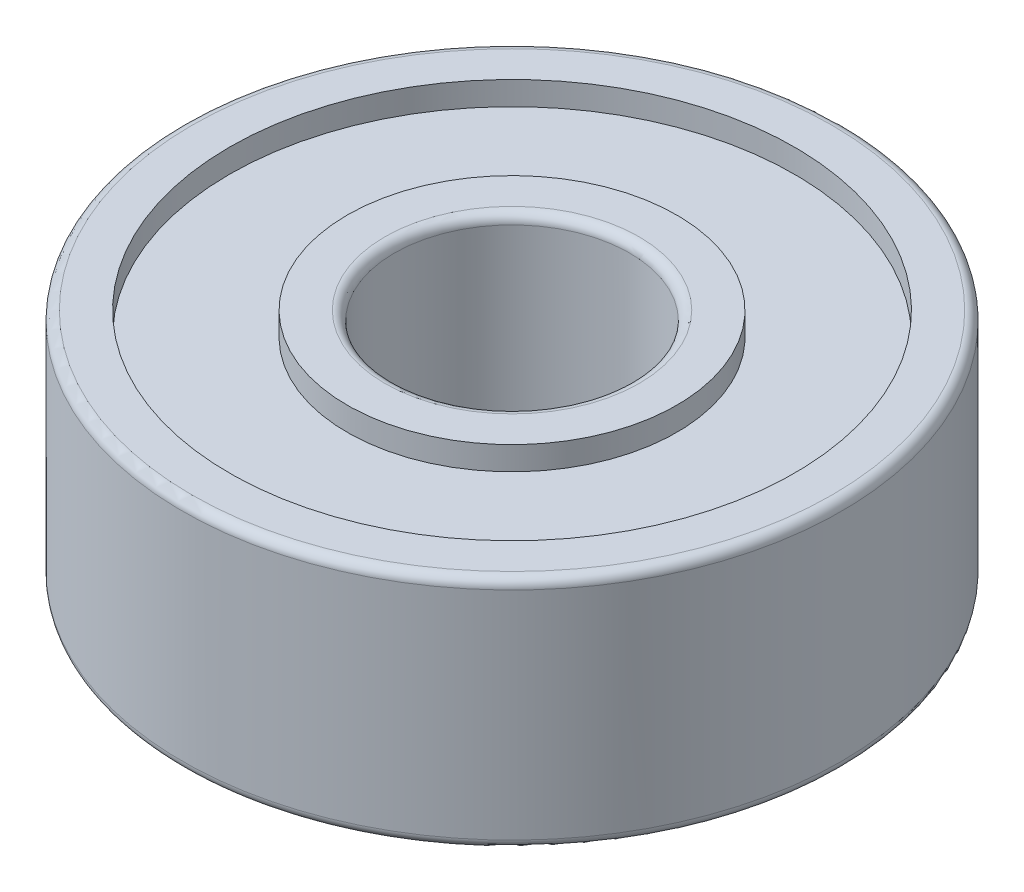
ISO-10303-21;
HEADER;
FILE_DESCRIPTION(('STEP AP214'),'2;1');
FILE_NAME('part.step','',(''),(''),'','','');
FILE_SCHEMA(('AUTOMOTIVE_DESIGN { 1 0 10303 214 1 1 1 1 }'));
ENDSEC;
DATA;
#1=APPLICATION_CONTEXT('core data for automotive mechanical design processes');
#2=APPLICATION_PROTOCOL_DEFINITION('international standard','automotive_design',2000,#1);
#3=PRODUCT_CONTEXT('',#1,'mechanical');
#4=PRODUCT('Part','Part','',(#3));
#5=PRODUCT_RELATED_PRODUCT_CATEGORY('part','',(#4));
#6=PRODUCT_DEFINITION_FORMATION('','',#4);
#7=PRODUCT_DEFINITION_CONTEXT('part definition',#1,'design');
#8=PRODUCT_DEFINITION('design','',#6,#7);
#9=PRODUCT_DEFINITION_SHAPE('','',#8);
#10=(LENGTH_UNIT() NAMED_UNIT(*) SI_UNIT(.MILLI.,.METRE.));
#11=(NAMED_UNIT(*) PLANE_ANGLE_UNIT() SI_UNIT($,.RADIAN.));
#12=(NAMED_UNIT(*) SI_UNIT($,.STERADIAN.) SOLID_ANGLE_UNIT());
#13=UNCERTAINTY_MEASURE_WITH_UNIT(LENGTH_MEASURE(1.E-05),#10,'distance_accuracy_value','');
#14=(GEOMETRIC_REPRESENTATION_CONTEXT(3) GLOBAL_UNCERTAINTY_ASSIGNED_CONTEXT((#13)) GLOBAL_UNIT_ASSIGNED_CONTEXT((#10,
#11,#12)) REPRESENTATION_CONTEXT('',''));
#15=CARTESIAN_POINT('',(0.,0.,0.));
#16=DIRECTION('',(0.,0.,1.));
#17=DIRECTION('',(1.,0.,0.));
#18=AXIS2_PLACEMENT_3D('',#15,#16,#17);
#19=CARTESIAN_POINT('',(0.,5.,0.));
#20=DIRECTION('',(0.,1.,0.));
#21=DIRECTION('',(-1.,0.,0.));
#22=AXIS2_PLACEMENT_3D('',#19,#20,#21);
#23=CYLINDRICAL_SURFACE('',#22,2.5);
#24=CARTESIAN_POINT('',(0.,0.200000000000003,0.));
#25=DIRECTION('',(0.,-1.,0.));
#26=DIRECTION('',(1.,0.,0.));
#27=AXIS2_PLACEMENT_3D('',#24,#25,#26);
#28=CIRCLE('',#27,2.5);
#29=CARTESIAN_POINT('',(2.5,0.200000000000005,0.));
#30=VERTEX_POINT('',#29);
#31=EDGE_CURVE('E55',#30,#30,#28,.T.);
#32=ORIENTED_EDGE('',*,*,#31,.T.);
#33=EDGE_LOOP('',(#32));
#34=FACE_BOUND('',#33,.T.);
#35=CARTESIAN_POINT('',(0.,4.8,0.));
#36=DIRECTION('',(0.,1.,0.));
#37=DIRECTION('',(-1.,0.,0.));
#38=AXIS2_PLACEMENT_3D('',#35,#36,#37);
#39=CIRCLE('',#38,2.5);
#40=CARTESIAN_POINT('',(-2.5,4.8,0.));
#41=VERTEX_POINT('',#40);
#42=EDGE_CURVE('E58',#41,#41,#39,.T.);
#43=ORIENTED_EDGE('',*,*,#42,.T.);
#44=EDGE_LOOP('',(#43));
#45=FACE_BOUND('',#44,.T.);
#46=ADVANCED_FACE('F32',(#34,#45),#23,.F.);
#47=CARTESIAN_POINT('',(-2.5,0.,0.));
#48=DIRECTION('',(0.,-1.,0.));
#49=DIRECTION('',(1.,0.,0.));
#50=AXIS2_PLACEMENT_3D('',#47,#48,#49);
#51=PLANE('',#50);
#52=CARTESIAN_POINT('',(0.,0.,0.));
#53=DIRECTION('',(0.,-1.,0.));
#54=DIRECTION('',(1.,0.,0.));
#55=AXIS2_PLACEMENT_3D('',#52,#53,#54);
#56=CIRCLE('',#55,2.7);
#57=CARTESIAN_POINT('',(2.7,0.,0.));
#58=VERTEX_POINT('',#57);
#59=EDGE_CURVE('E61',#58,#58,#56,.F.);
#60=ORIENTED_EDGE('',*,*,#59,.T.);
#61=EDGE_LOOP('',(#60));
#62=FACE_BOUND('',#61,.T.);
#63=CARTESIAN_POINT('',(0.,0.,0.));
#64=DIRECTION('',(0.,1.,0.));
#65=DIRECTION('',(-1.,0.,0.));
#66=AXIS2_PLACEMENT_3D('',#63,#64,#65);
#67=CIRCLE('',#66,3.5);
#68=CARTESIAN_POINT('',(-3.5,0.,0.));
#69=VERTEX_POINT('',#68);
#70=EDGE_CURVE('E64',#69,#69,#67,.T.);
#71=ORIENTED_EDGE('',*,*,#70,.F.);
#72=EDGE_LOOP('',(#71));
#73=FACE_BOUND('',#72,.T.);
#74=ADVANCED_FACE('F107',(#62,#73),#51,.T.);
#75=CARTESIAN_POINT('',(0.,5.,0.));
#76=DIRECTION('',(0.,1.,0.));
#77=DIRECTION('',(-1.,0.,0.));
#78=AXIS2_PLACEMENT_3D('',#75,#76,#77);
#79=CYLINDRICAL_SURFACE('',#78,3.5);
#80=ORIENTED_EDGE('',*,*,#70,.T.);
#81=EDGE_LOOP('',(#80));
#82=FACE_BOUND('',#81,.T.);
#83=CARTESIAN_POINT('',(0.,0.500000000000003,0.));
#84=DIRECTION('',(0.,1.,0.));
#85=DIRECTION('',(-1.,0.,0.));
#86=AXIS2_PLACEMENT_3D('',#83,#84,#85);
#87=CIRCLE('',#86,3.5);
#88=CARTESIAN_POINT('',(-3.5,0.5,0.));
#89=VERTEX_POINT('',#88);
#90=EDGE_CURVE('E67',#89,#89,#87,.T.);
#91=ORIENTED_EDGE('',*,*,#90,.F.);
#92=EDGE_LOOP('',(#91));
#93=FACE_BOUND('',#92,.T.);
#94=ADVANCED_FACE('F113',(#82,#93),#79,.T.);
#95=CARTESIAN_POINT('',(-3.5,0.500000000000001,0.));
#96=DIRECTION('',(0.,-1.,0.));
#97=DIRECTION('',(1.,0.,0.));
#98=AXIS2_PLACEMENT_3D('',#95,#96,#97);
#99=PLANE('',#98);
#100=ORIENTED_EDGE('',*,*,#90,.T.);
#101=EDGE_LOOP('',(#100));
#102=FACE_BOUND('',#101,.T.);
#103=CARTESIAN_POINT('',(0.,0.500000000000005,0.));
#104=DIRECTION('',(0.,1.,0.));
#105=DIRECTION('',(-1.,0.,0.));
#106=AXIS2_PLACEMENT_3D('',#103,#104,#105);
#107=CIRCLE('',#106,6.);
#108=CARTESIAN_POINT('',(-6.,0.499999999999999,0.));
#109=VERTEX_POINT('',#108);
#110=EDGE_CURVE('E70',#109,#109,#107,.T.);
#111=ORIENTED_EDGE('',*,*,#110,.F.);
#112=EDGE_LOOP('',(#111));
#113=FACE_BOUND('',#112,.T.);
#114=ADVANCED_FACE('F154',(#102,#113),#99,.T.);
#115=CARTESIAN_POINT('',(0.,5.,0.));
#116=DIRECTION('',(0.,1.,0.));
#117=DIRECTION('',(-1.,0.,0.));
#118=AXIS2_PLACEMENT_3D('',#115,#116,#117);
#119=CYLINDRICAL_SURFACE('',#118,6.);
#120=ORIENTED_EDGE('',*,*,#110,.T.);
#121=EDGE_LOOP('',(#120));
#122=FACE_BOUND('',#121,.T.);
#123=CARTESIAN_POINT('',(0.,0.,0.));
#124=DIRECTION('',(0.,1.,0.));
#125=DIRECTION('',(-1.,0.,0.));
#126=AXIS2_PLACEMENT_3D('',#123,#124,#125);
#127=CIRCLE('',#126,6.);
#128=CARTESIAN_POINT('',(-6.,0.,0.));
#129=VERTEX_POINT('',#128);
#130=EDGE_CURVE('E73',#129,#129,#127,.T.);
#131=ORIENTED_EDGE('',*,*,#130,.F.);
#132=EDGE_LOOP('',(#131));
#133=FACE_BOUND('',#132,.T.);
#134=ADVANCED_FACE('F148',(#122,#133),#119,.F.);
#135=CARTESIAN_POINT('',(-6.,0.,0.));
#136=DIRECTION('',(0.,-1.,0.));
#137=DIRECTION('',(1.,0.,0.));
#138=AXIS2_PLACEMENT_3D('',#135,#136,#137);
#139=PLANE('',#138);
#140=CARTESIAN_POINT('',(0.,0.,0.));
#141=DIRECTION('',(0.,-1.,0.));
#142=DIRECTION('',(1.,0.,0.));
#143=AXIS2_PLACEMENT_3D('',#140,#141,#142);
#144=CIRCLE('',#143,6.8);
#145=CARTESIAN_POINT('',(6.8,0.,0.));
#146=VERTEX_POINT('',#145);
#147=EDGE_CURVE('E39',#146,#146,#144,.T.);
#148=ORIENTED_EDGE('',*,*,#147,.T.);
#149=EDGE_LOOP('',(#148));
#150=FACE_BOUND('',#149,.T.);
#151=ORIENTED_EDGE('',*,*,#130,.T.);
#152=EDGE_LOOP('',(#151));
#153=FACE_BOUND('',#152,.T.);
#154=ADVANCED_FACE('F139',(#150,#153),#139,.T.);
#155=CARTESIAN_POINT('',(0.,5.,0.));
#156=DIRECTION('',(0.,1.,0.));
#157=DIRECTION('',(-1.,0.,0.));
#158=AXIS2_PLACEMENT_3D('',#155,#156,#157);
#159=CYLINDRICAL_SURFACE('',#158,7.);
#160=CARTESIAN_POINT('',(0.,0.200000000000005,0.));
#161=DIRECTION('',(0.,-1.,0.));
#162=DIRECTION('',(1.,0.,0.));
#163=AXIS2_PLACEMENT_3D('',#160,#161,#162);
#164=CIRCLE('',#163,7.);
#165=CARTESIAN_POINT('',(7.,0.200000000000011,0.));
#166=VERTEX_POINT('',#165);
#167=EDGE_CURVE('E43',#166,#166,#164,.F.);
#168=ORIENTED_EDGE('',*,*,#167,.T.);
#169=EDGE_LOOP('',(#168));
#170=FACE_BOUND('',#169,.T.);
#171=CARTESIAN_POINT('',(0.,4.80000000000001,0.));
#172=DIRECTION('',(0.,1.,0.));
#173=DIRECTION('',(-1.,0.,0.));
#174=AXIS2_PLACEMENT_3D('',#171,#172,#173);
#175=CIRCLE('',#174,7.);
#176=CARTESIAN_POINT('',(-7.,4.8,0.));
#177=VERTEX_POINT('',#176);
#178=EDGE_CURVE('E47',#177,#177,#175,.F.);
#179=ORIENTED_EDGE('',*,*,#178,.T.);
#180=EDGE_LOOP('',(#179));
#181=FACE_BOUND('',#180,.T.);
#182=ADVANCED_FACE('F135',(#170,#181),#159,.T.);
#183=CARTESIAN_POINT('',(-7.,5.,0.));
#184=DIRECTION('',(0.,1.,0.));
#185=DIRECTION('',(-1.,0.,0.));
#186=AXIS2_PLACEMENT_3D('',#183,#184,#185);
#187=PLANE('',#186);
#188=CARTESIAN_POINT('',(0.,5.,0.));
#189=DIRECTION('',(0.,1.,0.));
#190=DIRECTION('',(-1.,0.,0.));
#191=AXIS2_PLACEMENT_3D('',#188,#189,#190);
#192=CIRCLE('',#191,6.8);
#193=CARTESIAN_POINT('',(-6.8,5.,0.));
#194=VERTEX_POINT('',#193);
#195=EDGE_CURVE('E10',#194,#194,#192,.T.);
#196=ORIENTED_EDGE('',*,*,#195,.T.);
#197=EDGE_LOOP('',(#196));
#198=FACE_BOUND('',#197,.T.);
#199=CARTESIAN_POINT('',(0.,5.,0.));
#200=DIRECTION('',(0.,1.,0.));
#201=DIRECTION('',(-1.,0.,0.));
#202=AXIS2_PLACEMENT_3D('',#199,#200,#201);
#203=CIRCLE('',#202,5.99999999999999);
#204=CARTESIAN_POINT('',(-6.,5.,0.));
#205=VERTEX_POINT('',#204);
#206=EDGE_CURVE('E76',#205,#205,#203,.T.);
#207=ORIENTED_EDGE('',*,*,#206,.F.);
#208=EDGE_LOOP('',(#207));
#209=FACE_BOUND('',#208,.T.);
#210=ADVANCED_FACE('F138',(#198,#209),#187,.T.);
#211=CARTESIAN_POINT('',(0.,5.,0.));
#212=DIRECTION('',(0.,1.,0.));
#213=DIRECTION('',(-1.,0.,0.));
#214=AXIS2_PLACEMENT_3D('',#211,#212,#213);
#215=CYLINDRICAL_SURFACE('',#214,5.99999999999999);
#216=ORIENTED_EDGE('',*,*,#206,.T.);
#217=EDGE_LOOP('',(#216));
#218=FACE_BOUND('',#217,.T.);
#219=CARTESIAN_POINT('',(0.,4.5,0.));
#220=DIRECTION('',(0.,1.,0.));
#221=DIRECTION('',(-1.,0.,0.));
#222=AXIS2_PLACEMENT_3D('',#219,#220,#221);
#223=CIRCLE('',#222,6.);
#224=CARTESIAN_POINT('',(-6.,4.5,0.));
#225=VERTEX_POINT('',#224);
#226=EDGE_CURVE('E79',#225,#225,#223,.T.);
#227=ORIENTED_EDGE('',*,*,#226,.F.);
#228=EDGE_LOOP('',(#227));
#229=FACE_BOUND('',#228,.T.);
#230=ADVANCED_FACE('F103',(#218,#229),#215,.F.);
#231=CARTESIAN_POINT('',(-6.,4.5,0.));
#232=DIRECTION('',(0.,1.,0.));
#233=DIRECTION('',(-1.,0.,0.));
#234=AXIS2_PLACEMENT_3D('',#231,#232,#233);
#235=PLANE('',#234);
#236=ORIENTED_EDGE('',*,*,#226,.T.);
#237=EDGE_LOOP('',(#236));
#238=FACE_BOUND('',#237,.T.);
#239=CARTESIAN_POINT('',(0.,4.5,0.));
#240=DIRECTION('',(0.,1.,0.));
#241=DIRECTION('',(-1.,0.,0.));
#242=AXIS2_PLACEMENT_3D('',#239,#240,#241);
#243=CIRCLE('',#242,3.5);
#244=CARTESIAN_POINT('',(-3.5,4.5,0.));
#245=VERTEX_POINT('',#244);
#246=EDGE_CURVE('E82',#245,#245,#243,.T.);
#247=ORIENTED_EDGE('',*,*,#246,.F.);
#248=EDGE_LOOP('',(#247));
#249=FACE_BOUND('',#248,.T.);
#250=ADVANCED_FACE('F93',(#238,#249),#235,.T.);
#251=CARTESIAN_POINT('',(0.,5.,0.));
#252=DIRECTION('',(0.,1.,0.));
#253=DIRECTION('',(-1.,0.,0.));
#254=AXIS2_PLACEMENT_3D('',#251,#252,#253);
#255=CYLINDRICAL_SURFACE('',#254,3.5);
#256=ORIENTED_EDGE('',*,*,#246,.T.);
#257=EDGE_LOOP('',(#256));
#258=FACE_BOUND('',#257,.T.);
#259=CARTESIAN_POINT('',(0.,5.,0.));
#260=DIRECTION('',(0.,1.,0.));
#261=DIRECTION('',(-1.,0.,0.));
#262=AXIS2_PLACEMENT_3D('',#259,#260,#261);
#263=CIRCLE('',#262,3.5);
#264=CARTESIAN_POINT('',(-3.5,5.,0.));
#265=VERTEX_POINT('',#264);
#266=EDGE_CURVE('E85',#265,#265,#263,.T.);
#267=ORIENTED_EDGE('',*,*,#266,.F.);
#268=EDGE_LOOP('',(#267));
#269=FACE_BOUND('',#268,.T.);
#270=ADVANCED_FACE('F91',(#258,#269),#255,.T.);
#271=CARTESIAN_POINT('',(-3.5,5.,0.));
#272=DIRECTION('',(0.,1.,0.));
#273=DIRECTION('',(-1.,0.,0.));
#274=AXIS2_PLACEMENT_3D('',#271,#272,#273);
#275=PLANE('',#274);
#276=CARTESIAN_POINT('',(0.,5.,0.));
#277=DIRECTION('',(0.,1.,0.));
#278=DIRECTION('',(-1.,0.,0.));
#279=AXIS2_PLACEMENT_3D('',#276,#277,#278);
#280=CIRCLE('',#279,2.7);
#281=CARTESIAN_POINT('',(-2.7,5.,0.));
#282=VERTEX_POINT('',#281);
#283=EDGE_CURVE('E52',#282,#282,#280,.F.);
#284=ORIENTED_EDGE('',*,*,#283,.T.);
#285=EDGE_LOOP('',(#284));
#286=FACE_BOUND('',#285,.T.);
#287=ORIENTED_EDGE('',*,*,#266,.T.);
#288=EDGE_LOOP('',(#287));
#289=FACE_BOUND('',#288,.T.);
#290=ADVANCED_FACE('F89',(#286,#289),#275,.T.);
#291=CARTESIAN_POINT('',(0.,0.200000000000003,0.));
#292=DIRECTION('',(0.,-1.,0.));
#293=DIRECTION('',(1.,0.,0.));
#294=AXIS2_PLACEMENT_3D('',#291,#292,#293);
#295=TOROIDAL_SURFACE('',#294,2.7,0.2);
#296=ORIENTED_EDGE('',*,*,#31,.F.);
#297=EDGE_LOOP('',(#296));
#298=FACE_BOUND('',#297,.T.);
#299=ORIENTED_EDGE('',*,*,#59,.F.);
#300=EDGE_LOOP('',(#299));
#301=FACE_BOUND('',#300,.T.);
#302=ADVANCED_FACE('F100',(#298,#301),#295,.T.);
#303=CARTESIAN_POINT('',(0.,4.8,0.));
#304=DIRECTION('',(0.,1.,0.));
#305=DIRECTION('',(-1.,0.,0.));
#306=AXIS2_PLACEMENT_3D('',#303,#304,#305);
#307=TOROIDAL_SURFACE('',#306,2.7,0.2);
#308=ORIENTED_EDGE('',*,*,#283,.F.);
#309=EDGE_LOOP('',(#308));
#310=FACE_BOUND('',#309,.T.);
#311=ORIENTED_EDGE('',*,*,#42,.F.);
#312=EDGE_LOOP('',(#311));
#313=FACE_BOUND('',#312,.T.);
#314=ADVANCED_FACE('F121',(#310,#313),#307,.T.);
#315=CARTESIAN_POINT('',(0.,0.200000000000005,0.));
#316=DIRECTION('',(0.,-1.,0.));
#317=DIRECTION('',(1.,0.,0.));
#318=AXIS2_PLACEMENT_3D('',#315,#316,#317);
#319=TOROIDAL_SURFACE('',#318,6.8,0.2);
#320=ORIENTED_EDGE('',*,*,#147,.F.);
#321=EDGE_LOOP('',(#320));
#322=FACE_BOUND('',#321,.T.);
#323=ORIENTED_EDGE('',*,*,#167,.F.);
#324=EDGE_LOOP('',(#323));
#325=FACE_BOUND('',#324,.T.);
#326=ADVANCED_FACE('F124',(#322,#325),#319,.T.);
#327=CARTESIAN_POINT('',(0.,4.80000000000001,0.));
#328=DIRECTION('',(0.,1.,0.));
#329=DIRECTION('',(-1.,0.,0.));
#330=AXIS2_PLACEMENT_3D('',#327,#328,#329);
#331=TOROIDAL_SURFACE('',#330,6.8,0.2);
#332=ORIENTED_EDGE('',*,*,#178,.F.);
#333=EDGE_LOOP('',(#332));
#334=FACE_BOUND('',#333,.T.);
#335=ORIENTED_EDGE('',*,*,#195,.F.);
#336=EDGE_LOOP('',(#335));
#337=FACE_BOUND('',#336,.T.);
#338=ADVANCED_FACE('F34',(#334,#337),#331,.T.);
#339=CLOSED_SHELL('',(#46,#74,#94,#114,#134,#154,#182,#210,#230,#250,#270,#290,#302,#314,#326,#338));
#340=MANIFOLD_SOLID_BREP('B2',#339);
#341=ADVANCED_BREP_SHAPE_REPRESENTATION('',(#18,#340),#14);
#342=SHAPE_DEFINITION_REPRESENTATION(#9,#341);
ENDSEC;
END-ISO-10303-21;
